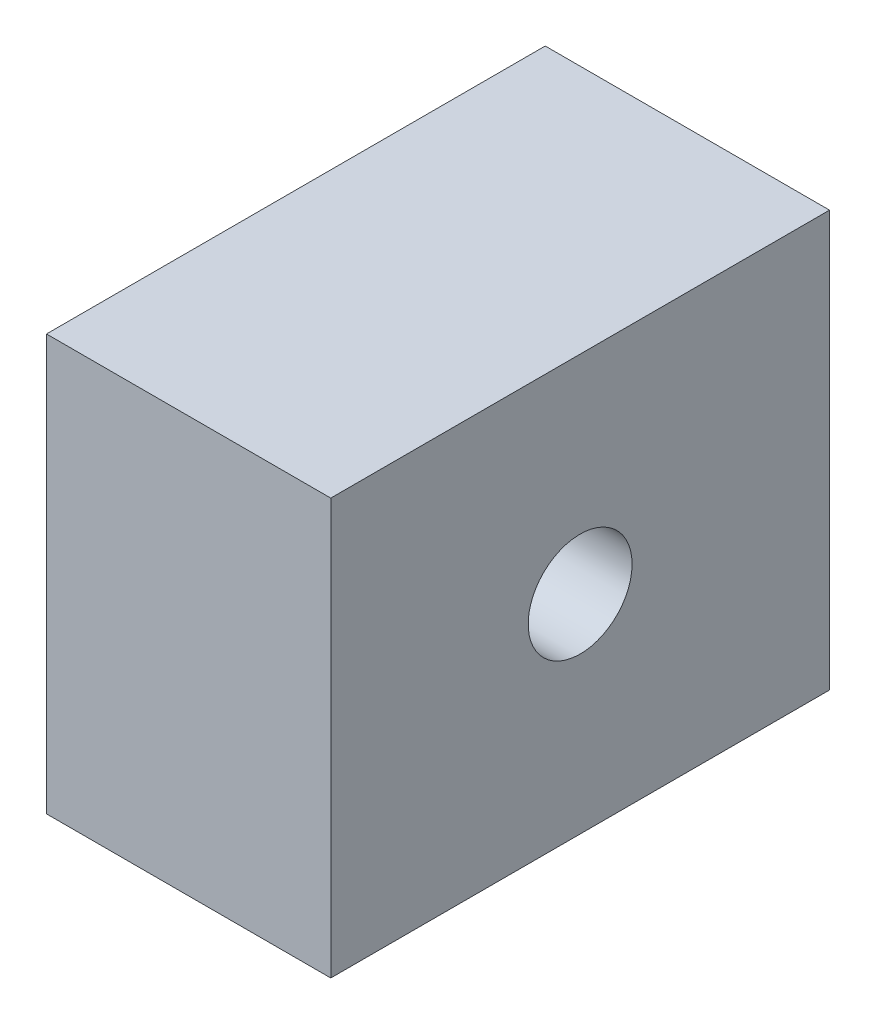
ISO-10303-21;
HEADER;
FILE_DESCRIPTION(('STEP AP214'),'2;1');
FILE_NAME('part.step','',(''),(''),'','','');
FILE_SCHEMA(('AUTOMOTIVE_DESIGN { 1 0 10303 214 1 1 1 1 }'));
ENDSEC;
DATA;
#1=APPLICATION_CONTEXT('core data for automotive mechanical design processes');
#2=APPLICATION_PROTOCOL_DEFINITION('international standard','automotive_design',2000,#1);
#3=PRODUCT_CONTEXT('',#1,'mechanical');
#4=PRODUCT('Part','Part','',(#3));
#5=PRODUCT_RELATED_PRODUCT_CATEGORY('part','',(#4));
#6=PRODUCT_DEFINITION_FORMATION('','',#4);
#7=PRODUCT_DEFINITION_CONTEXT('part definition',#1,'design');
#8=PRODUCT_DEFINITION('design','',#6,#7);
#9=PRODUCT_DEFINITION_SHAPE('','',#8);
#10=(LENGTH_UNIT() NAMED_UNIT(*) SI_UNIT(.MILLI.,.METRE.));
#11=(NAMED_UNIT(*) PLANE_ANGLE_UNIT() SI_UNIT($,.RADIAN.));
#12=(NAMED_UNIT(*) SI_UNIT($,.STERADIAN.) SOLID_ANGLE_UNIT());
#13=UNCERTAINTY_MEASURE_WITH_UNIT(LENGTH_MEASURE(1.E-05),#10,'distance_accuracy_value','');
#14=(GEOMETRIC_REPRESENTATION_CONTEXT(3) GLOBAL_UNCERTAINTY_ASSIGNED_CONTEXT((#13)) GLOBAL_UNIT_ASSIGNED_CONTEXT((#10,
#11,#12)) REPRESENTATION_CONTEXT('',''));
#15=CARTESIAN_POINT('',(0.,0.,0.));
#16=DIRECTION('',(0.,0.,1.));
#17=DIRECTION('',(1.,0.,0.));
#18=AXIS2_PLACEMENT_3D('',#15,#16,#17);
#19=CARTESIAN_POINT('',(0.,0.,12.));
#20=DIRECTION('',(0.,0.,1.));
#21=DIRECTION('',(1.,0.,0.));
#22=AXIS2_PLACEMENT_3D('',#19,#20,#21);
#23=PLANE('',#22);
#24=DIRECTION('',(-1.,0.,0.));
#25=VECTOR('',#24,1.);
#26=CARTESIAN_POINT('',(0.,-5.,12.));
#27=LINE('',#26,#25);
#28=CARTESIAN_POINT('',(3.41999999999999,-5.,12.));
#29=VERTEX_POINT('',#28);
#30=CARTESIAN_POINT('',(-3.41999999999999,-5.,12.));
#31=VERTEX_POINT('',#30);
#32=EDGE_CURVE('E11',#29,#31,#27,.T.);
#33=ORIENTED_EDGE('',*,*,#32,.F.);
#34=DIRECTION('',(0.,-1.,0.));
#35=VECTOR('',#34,1.);
#36=CARTESIAN_POINT('',(3.41999999999999,0.,12.));
#37=LINE('',#36,#35);
#38=CARTESIAN_POINT('',(3.41999999999999,5.,12.));
#39=VERTEX_POINT('',#38);
#40=EDGE_CURVE('E63',#39,#29,#37,.T.);
#41=ORIENTED_EDGE('',*,*,#40,.F.);
#42=DIRECTION('',(1.,0.,0.));
#43=VECTOR('',#42,1.);
#44=CARTESIAN_POINT('',(0.,5.,12.));
#45=LINE('',#44,#43);
#46=CARTESIAN_POINT('',(-3.41999999999999,5.,12.));
#47=VERTEX_POINT('',#46);
#48=EDGE_CURVE('E103',#47,#39,#45,.T.);
#49=ORIENTED_EDGE('',*,*,#48,.F.);
#50=DIRECTION('',(0.,1.,0.));
#51=VECTOR('',#50,1.);
#52=CARTESIAN_POINT('',(-3.41999999999999,0.,12.));
#53=LINE('',#52,#51);
#54=EDGE_CURVE('E26',#31,#47,#53,.T.);
#55=ORIENTED_EDGE('',*,*,#54,.F.);
#56=EDGE_LOOP('',(#33,#41,#49,#55));
#57=FACE_BOUND('',#56,.T.);
#58=ADVANCED_FACE('F17',(#57),#23,.T.);
#59=CARTESIAN_POINT('',(0.,-5.,0.));
#60=DIRECTION('',(0.,-1.,0.));
#61=DIRECTION('',(0.,0.,-1.));
#62=AXIS2_PLACEMENT_3D('',#59,#60,#61);
#63=PLANE('',#62);
#64=DIRECTION('',(0.,0.,1.));
#65=VECTOR('',#64,1.);
#66=CARTESIAN_POINT('',(3.41999999999999,-5.,0.));
#67=LINE('',#66,#65);
#68=CARTESIAN_POINT('',(3.41999999999999,-5.,0.));
#69=VERTEX_POINT('',#68);
#70=EDGE_CURVE('E56',#69,#29,#67,.T.);
#71=ORIENTED_EDGE('',*,*,#70,.T.);
#72=ORIENTED_EDGE('',*,*,#32,.T.);
#73=DIRECTION('',(0.,0.,1.));
#74=VECTOR('',#73,1.);
#75=CARTESIAN_POINT('',(-3.41999999999999,-5.,0.));
#76=LINE('',#75,#74);
#77=CARTESIAN_POINT('',(-3.41999999999999,-5.,0.));
#78=VERTEX_POINT('',#77);
#79=EDGE_CURVE('E70',#78,#31,#76,.T.);
#80=ORIENTED_EDGE('',*,*,#79,.F.);
#81=DIRECTION('',(1.,0.,0.));
#82=VECTOR('',#81,1.);
#83=CARTESIAN_POINT('',(0.,-5.,0.));
#84=LINE('',#83,#82);
#85=EDGE_CURVE('E68',#78,#69,#84,.T.);
#86=ORIENTED_EDGE('',*,*,#85,.T.);
#87=EDGE_LOOP('',(#71,#72,#80,#86));
#88=FACE_BOUND('',#87,.T.);
#89=ADVANCED_FACE('F69',(#88),#63,.T.);
#90=CARTESIAN_POINT('',(-3.41999999999999,0.,0.));
#91=DIRECTION('',(-1.,0.,0.));
#92=DIRECTION('',(0.,0.,1.));
#93=AXIS2_PLACEMENT_3D('',#90,#91,#92);
#94=PLANE('',#93);
#95=CARTESIAN_POINT('',(-3.41999999999999,0.,6.));
#96=DIRECTION('',(-1.,0.,0.));
#97=DIRECTION('',(0.,0.,1.));
#98=AXIS2_PLACEMENT_3D('',#95,#96,#97);
#99=CIRCLE('',#98,1.25);
#100=CARTESIAN_POINT('',(-3.41999999999999,0.,7.25));
#101=VERTEX_POINT('',#100);
#102=EDGE_CURVE('E76',#101,#101,#99,.T.);
#103=ORIENTED_EDGE('',*,*,#102,.F.);
#104=EDGE_LOOP('',(#103));
#105=FACE_BOUND('',#104,.T.);
#106=ORIENTED_EDGE('',*,*,#79,.T.);
#107=ORIENTED_EDGE('',*,*,#54,.T.);
#108=DIRECTION('',(0.,0.,1.));
#109=VECTOR('',#108,1.);
#110=CARTESIAN_POINT('',(-3.41999999999999,5.,0.));
#111=LINE('',#110,#109);
#112=CARTESIAN_POINT('',(-3.41999999999999,5.,0.));
#113=VERTEX_POINT('',#112);
#114=EDGE_CURVE('E95',#113,#47,#111,.T.);
#115=ORIENTED_EDGE('',*,*,#114,.F.);
#116=DIRECTION('',(0.,-1.,0.));
#117=VECTOR('',#116,1.);
#118=CARTESIAN_POINT('',(-3.41999999999999,0.,0.));
#119=LINE('',#118,#117);
#120=EDGE_CURVE('E75',#113,#78,#119,.T.);
#121=ORIENTED_EDGE('',*,*,#120,.T.);
#122=EDGE_LOOP('',(#106,#107,#115,#121));
#123=FACE_BOUND('',#122,.T.);
#124=ADVANCED_FACE('F131',(#105,#123),#94,.T.);
#125=CARTESIAN_POINT('',(0.,5.,0.));
#126=DIRECTION('',(0.,1.,0.));
#127=DIRECTION('',(0.,0.,1.));
#128=AXIS2_PLACEMENT_3D('',#125,#126,#127);
#129=PLANE('',#128);
#130=ORIENTED_EDGE('',*,*,#114,.T.);
#131=ORIENTED_EDGE('',*,*,#48,.T.);
#132=DIRECTION('',(0.,0.,1.));
#133=VECTOR('',#132,1.);
#134=CARTESIAN_POINT('',(3.41999999999999,5.,0.));
#135=LINE('',#134,#133);
#136=CARTESIAN_POINT('',(3.41999999999999,5.,0.));
#137=VERTEX_POINT('',#136);
#138=EDGE_CURVE('E65',#137,#39,#135,.T.);
#139=ORIENTED_EDGE('',*,*,#138,.F.);
#140=DIRECTION('',(-1.,0.,0.));
#141=VECTOR('',#140,1.);
#142=CARTESIAN_POINT('',(0.,5.,0.));
#143=LINE('',#142,#141);
#144=EDGE_CURVE('E81',#137,#113,#143,.T.);
#145=ORIENTED_EDGE('',*,*,#144,.T.);
#146=EDGE_LOOP('',(#130,#131,#139,#145));
#147=FACE_BOUND('',#146,.T.);
#148=ADVANCED_FACE('F124',(#147),#129,.T.);
#149=CARTESIAN_POINT('',(0.,0.,0.));
#150=DIRECTION('',(0.,0.,-1.));
#151=DIRECTION('',(-1.,0.,0.));
#152=AXIS2_PLACEMENT_3D('',#149,#150,#151);
#153=PLANE('',#152);
#154=DIRECTION('',(0.,1.,0.));
#155=VECTOR('',#154,1.);
#156=CARTESIAN_POINT('',(3.41999999999999,0.,0.));
#157=LINE('',#156,#155);
#158=EDGE_CURVE('E61',#69,#137,#157,.T.);
#159=ORIENTED_EDGE('',*,*,#158,.F.);
#160=ORIENTED_EDGE('',*,*,#85,.F.);
#161=ORIENTED_EDGE('',*,*,#120,.F.);
#162=ORIENTED_EDGE('',*,*,#144,.F.);
#163=EDGE_LOOP('',(#159,#160,#161,#162));
#164=FACE_BOUND('',#163,.T.);
#165=ADVANCED_FACE('F79',(#164),#153,.T.);
#166=CARTESIAN_POINT('',(3.41999999999999,0.,0.));
#167=DIRECTION('',(1.,0.,0.));
#168=DIRECTION('',(0.,0.,-1.));
#169=AXIS2_PLACEMENT_3D('',#166,#167,#168);
#170=PLANE('',#169);
#171=CARTESIAN_POINT('',(3.41999999999999,0.,6.));
#172=DIRECTION('',(1.,0.,0.));
#173=DIRECTION('',(0.,0.,-1.));
#174=AXIS2_PLACEMENT_3D('',#171,#172,#173);
#175=CIRCLE('',#174,1.25);
#176=CARTESIAN_POINT('',(3.41999999999999,0.,4.75));
#177=VERTEX_POINT('',#176);
#178=EDGE_CURVE('E20',#177,#177,#175,.T.);
#179=ORIENTED_EDGE('',*,*,#178,.F.);
#180=EDGE_LOOP('',(#179));
#181=FACE_BOUND('',#180,.T.);
#182=ORIENTED_EDGE('',*,*,#158,.T.);
#183=ORIENTED_EDGE('',*,*,#138,.T.);
#184=ORIENTED_EDGE('',*,*,#40,.T.);
#185=ORIENTED_EDGE('',*,*,#70,.F.);
#186=EDGE_LOOP('',(#182,#183,#184,#185));
#187=FACE_BOUND('',#186,.T.);
#188=ADVANCED_FACE('F58',(#181,#187),#170,.T.);
#189=CARTESIAN_POINT('',(-3.81999999999999,0.,6.));
#190=DIRECTION('',(1.,0.,0.));
#191=DIRECTION('',(0.,0.,-1.));
#192=AXIS2_PLACEMENT_3D('',#189,#190,#191);
#193=CYLINDRICAL_SURFACE('',#192,1.25);
#194=ORIENTED_EDGE('',*,*,#102,.T.);
#195=EDGE_LOOP('',(#194));
#196=FACE_BOUND('',#195,.T.);
#197=ORIENTED_EDGE('',*,*,#178,.T.);
#198=EDGE_LOOP('',(#197));
#199=FACE_BOUND('',#198,.T.);
#200=ADVANCED_FACE('F115',(#196,#199),#193,.F.);
#201=CLOSED_SHELL('',(#58,#89,#124,#148,#165,#188,#200));
#202=MANIFOLD_SOLID_BREP('B1',#201);
#203=ADVANCED_BREP_SHAPE_REPRESENTATION('',(#18,#202),#14);
#204=SHAPE_DEFINITION_REPRESENTATION(#9,#203);
ENDSEC;
END-ISO-10303-21;
